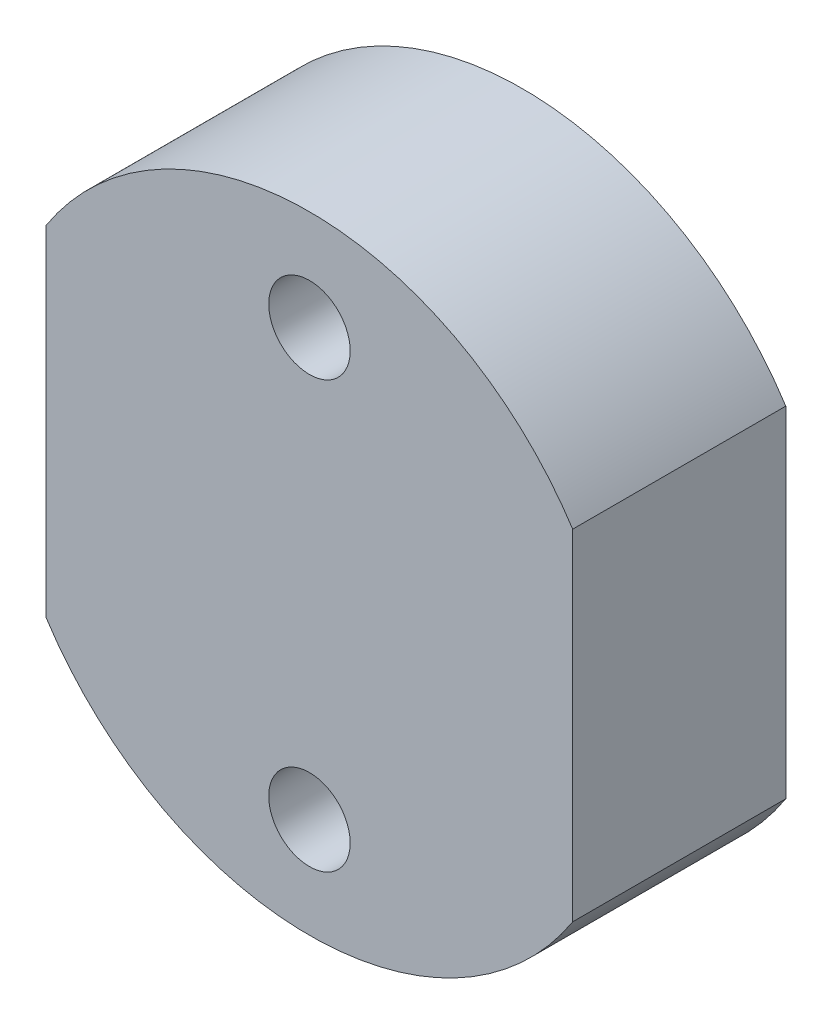
ISO-10303-21;
HEADER;
FILE_DESCRIPTION(('STEP AP214'),'2;1');
FILE_NAME('part.step','',(''),(''),'','','');
FILE_SCHEMA(('AUTOMOTIVE_DESIGN { 1 0 10303 214 1 1 1 1 }'));
ENDSEC;
DATA;
#1=APPLICATION_CONTEXT('core data for automotive mechanical design processes');
#2=APPLICATION_PROTOCOL_DEFINITION('international standard','automotive_design',2000,#1);
#3=PRODUCT_CONTEXT('',#1,'mechanical');
#4=PRODUCT('Part','Part','',(#3));
#5=PRODUCT_RELATED_PRODUCT_CATEGORY('part','',(#4));
#6=PRODUCT_DEFINITION_FORMATION('','',#4);
#7=PRODUCT_DEFINITION_CONTEXT('part definition',#1,'design');
#8=PRODUCT_DEFINITION('design','',#6,#7);
#9=PRODUCT_DEFINITION_SHAPE('','',#8);
#10=(LENGTH_UNIT() NAMED_UNIT(*) SI_UNIT(.MILLI.,.METRE.));
#11=(NAMED_UNIT(*) PLANE_ANGLE_UNIT() SI_UNIT($,.RADIAN.));
#12=(NAMED_UNIT(*) SI_UNIT($,.STERADIAN.) SOLID_ANGLE_UNIT());
#13=UNCERTAINTY_MEASURE_WITH_UNIT(LENGTH_MEASURE(1.E-05),#10,'distance_accuracy_value','');
#14=(GEOMETRIC_REPRESENTATION_CONTEXT(3) GLOBAL_UNCERTAINTY_ASSIGNED_CONTEXT((#13)) GLOBAL_UNIT_ASSIGNED_CONTEXT((#10,
#11,#12)) REPRESENTATION_CONTEXT('',''));
#15=CARTESIAN_POINT('',(0.,0.,0.));
#16=DIRECTION('',(0.,0.,1.));
#17=DIRECTION('',(1.,0.,0.));
#18=AXIS2_PLACEMENT_3D('',#15,#16,#17);
#19=CARTESIAN_POINT('',(0.,0.,0.));
#20=DIRECTION('',(0.,0.,1.));
#21=DIRECTION('',(1.,0.,0.));
#22=AXIS2_PLACEMENT_3D('',#19,#20,#21);
#23=PLANE('',#22);
#24=CARTESIAN_POINT('',(0.,0.,0.));
#25=DIRECTION('',(0.,0.,1.));
#26=DIRECTION('',(1.,0.,0.));
#27=AXIS2_PLACEMENT_3D('',#24,#25,#26);
#28=CIRCLE('',#27,2.5);
#29=CARTESIAN_POINT('',(2.10000000000001,-1.35646599662505,0.));
#30=VERTEX_POINT('',#29);
#31=CARTESIAN_POINT('',(-2.1,-1.35646599662506,0.));
#32=VERTEX_POINT('',#31);
#33=EDGE_CURVE('E64',#30,#32,#28,.F.);
#34=ORIENTED_EDGE('',*,*,#33,.F.);
#35=DIRECTION('',(0.,1.,0.));
#36=VECTOR('',#35,1.);
#37=CARTESIAN_POINT('',(2.09999999999999,1.35646599662505,0.));
#38=LINE('',#37,#36);
#39=CARTESIAN_POINT('',(2.09999999999999,1.35646599662506,0.));
#40=VERTEX_POINT('',#39);
#41=EDGE_CURVE('E59',#40,#30,#38,.F.);
#42=ORIENTED_EDGE('',*,*,#41,.F.);
#43=CARTESIAN_POINT('',(0.,0.,0.));
#44=DIRECTION('',(0.,0.,1.));
#45=DIRECTION('',(1.,0.,0.));
#46=AXIS2_PLACEMENT_3D('',#43,#44,#45);
#47=CIRCLE('',#46,2.5);
#48=CARTESIAN_POINT('',(-2.1,1.35646599662505,0.));
#49=VERTEX_POINT('',#48);
#50=EDGE_CURVE('E78',#49,#40,#47,.F.);
#51=ORIENTED_EDGE('',*,*,#50,.F.);
#52=DIRECTION('',(0.,-1.,0.));
#53=VECTOR('',#52,1.);
#54=CARTESIAN_POINT('',(-2.1,1.35646599662505,0.));
#55=LINE('',#54,#53);
#56=EDGE_CURVE('E74',#32,#49,#55,.F.);
#57=ORIENTED_EDGE('',*,*,#56,.F.);
#58=EDGE_LOOP('',(#34,#42,#51,#57));
#59=FACE_BOUND('',#58,.T.);
#60=CARTESIAN_POINT('',(0.,1.70000000000003,0.));
#61=DIRECTION('',(0.,0.,1.));
#62=DIRECTION('',(1.,0.,0.));
#63=AXIS2_PLACEMENT_3D('',#60,#61,#62);
#64=CIRCLE('',#63,0.325);
#65=CARTESIAN_POINT('',(0.325,1.70000000000003,0.));
#66=VERTEX_POINT('',#65);
#67=EDGE_CURVE('E82',#66,#66,#64,.F.);
#68=ORIENTED_EDGE('',*,*,#67,.T.);
#69=EDGE_LOOP('',(#68));
#70=FACE_BOUND('',#69,.T.);
#71=CARTESIAN_POINT('',(0.,-1.70000000000003,0.));
#72=DIRECTION('',(0.,0.,1.));
#73=DIRECTION('',(1.,0.,0.));
#74=AXIS2_PLACEMENT_3D('',#71,#72,#73);
#75=CIRCLE('',#74,0.325);
#76=CARTESIAN_POINT('',(0.325,-1.70000000000003,0.));
#77=VERTEX_POINT('',#76);
#78=EDGE_CURVE('E20',#77,#77,#75,.F.);
#79=ORIENTED_EDGE('',*,*,#78,.T.);
#80=EDGE_LOOP('',(#79));
#81=FACE_BOUND('',#80,.T.);
#82=ADVANCED_FACE('F17',(#59,#70,#81),#23,.T.);
#83=CARTESIAN_POINT('',(0.,-1.70000000000003,-1.7));
#84=DIRECTION('',(0.,0.,1.));
#85=DIRECTION('',(1.,0.,0.));
#86=AXIS2_PLACEMENT_3D('',#83,#84,#85);
#87=CYLINDRICAL_SURFACE('',#86,0.325);
#88=CARTESIAN_POINT('',(0.,-1.70000000000003,-1.7));
#89=DIRECTION('',(0.,0.,1.));
#90=DIRECTION('',(1.,0.,0.));
#91=AXIS2_PLACEMENT_3D('',#88,#89,#90);
#92=CIRCLE('',#91,0.325);
#93=CARTESIAN_POINT('',(0.325,-1.70000000000003,-1.7));
#94=VERTEX_POINT('',#93);
#95=EDGE_CURVE('E100',#94,#94,#92,.F.);
#96=ORIENTED_EDGE('',*,*,#95,.T.);
#97=EDGE_LOOP('',(#96));
#98=FACE_BOUND('',#97,.T.);
#99=ORIENTED_EDGE('',*,*,#78,.F.);
#100=EDGE_LOOP('',(#99));
#101=FACE_BOUND('',#100,.T.);
#102=ADVANCED_FACE('F113',(#98,#101),#87,.F.);
#103=CARTESIAN_POINT('',(0.,1.70000000000003,-1.7));
#104=DIRECTION('',(0.,0.,1.));
#105=DIRECTION('',(1.,0.,0.));
#106=AXIS2_PLACEMENT_3D('',#103,#104,#105);
#107=CYLINDRICAL_SURFACE('',#106,0.325);
#108=CARTESIAN_POINT('',(0.,1.70000000000003,-1.7));
#109=DIRECTION('',(0.,0.,1.));
#110=DIRECTION('',(1.,0.,0.));
#111=AXIS2_PLACEMENT_3D('',#108,#109,#110);
#112=CIRCLE('',#111,0.325);
#113=CARTESIAN_POINT('',(0.325,1.70000000000003,-1.7));
#114=VERTEX_POINT('',#113);
#115=EDGE_CURVE('E96',#114,#114,#112,.F.);
#116=ORIENTED_EDGE('',*,*,#115,.T.);
#117=EDGE_LOOP('',(#116));
#118=FACE_BOUND('',#117,.T.);
#119=ORIENTED_EDGE('',*,*,#67,.F.);
#120=EDGE_LOOP('',(#119));
#121=FACE_BOUND('',#120,.T.);
#122=ADVANCED_FACE('F115',(#118,#121),#107,.F.);
#123=CARTESIAN_POINT('',(-2.1,1.35646599662505,-1.7));
#124=DIRECTION('',(-1.,0.,0.));
#125=DIRECTION('',(0.,-1.,0.));
#126=AXIS2_PLACEMENT_3D('',#123,#124,#125);
#127=PLANE('',#126);
#128=DIRECTION('',(0.,1.,0.));
#129=VECTOR('',#128,1.);
#130=CARTESIAN_POINT('',(-2.1,0.,-1.7));
#131=LINE('',#130,#129);
#132=CARTESIAN_POINT('',(-2.1,1.35646599662505,-1.7));
#133=VERTEX_POINT('',#132);
#134=CARTESIAN_POINT('',(-2.1,-1.35646599662506,-1.7));
#135=VERTEX_POINT('',#134);
#136=EDGE_CURVE('E86',#133,#135,#131,.F.);
#137=ORIENTED_EDGE('',*,*,#136,.T.);
#138=DIRECTION('',(0.,0.,1.));
#139=VECTOR('',#138,1.);
#140=CARTESIAN_POINT('',(-2.1,-1.35646599662506,-1.7));
#141=LINE('',#140,#139);
#142=EDGE_CURVE('E69',#32,#135,#141,.F.);
#143=ORIENTED_EDGE('',*,*,#142,.F.);
#144=ORIENTED_EDGE('',*,*,#56,.T.);
#145=DIRECTION('',(0.,0.,1.));
#146=VECTOR('',#145,1.);
#147=CARTESIAN_POINT('',(-2.1,1.35646599662505,-1.7));
#148=LINE('',#147,#146);
#149=EDGE_CURVE('E103',#133,#49,#148,.T.);
#150=ORIENTED_EDGE('',*,*,#149,.F.);
#151=EDGE_LOOP('',(#137,#143,#144,#150));
#152=FACE_BOUND('',#151,.T.);
#153=ADVANCED_FACE('F85',(#152),#127,.T.);
#154=CARTESIAN_POINT('',(0.,0.,-1.7));
#155=DIRECTION('',(0.,0.,1.));
#156=DIRECTION('',(1.,0.,0.));
#157=AXIS2_PLACEMENT_3D('',#154,#155,#156);
#158=CYLINDRICAL_SURFACE('',#157,2.5);
#159=CARTESIAN_POINT('',(0.,0.,-1.7));
#160=DIRECTION('',(0.,0.,1.));
#161=DIRECTION('',(1.,0.,0.));
#162=AXIS2_PLACEMENT_3D('',#159,#160,#161);
#163=CIRCLE('',#162,2.5);
#164=CARTESIAN_POINT('',(2.10000000000001,-1.35646599662505,-1.7));
#165=VERTEX_POINT('',#164);
#166=EDGE_CURVE('E93',#135,#165,#163,.T.);
#167=ORIENTED_EDGE('',*,*,#166,.T.);
#168=DIRECTION('',(0.,0.,1.));
#169=VECTOR('',#168,1.);
#170=CARTESIAN_POINT('',(2.10000000000001,-1.35646599662505,-1.7));
#171=LINE('',#170,#169);
#172=EDGE_CURVE('E71',#30,#165,#171,.F.);
#173=ORIENTED_EDGE('',*,*,#172,.F.);
#174=ORIENTED_EDGE('',*,*,#33,.T.);
#175=ORIENTED_EDGE('',*,*,#142,.T.);
#176=EDGE_LOOP('',(#167,#173,#174,#175));
#177=FACE_BOUND('',#176,.T.);
#178=ADVANCED_FACE('F67',(#177),#158,.T.);
#179=CARTESIAN_POINT('',(2.09999999999999,1.35646599662505,-1.7));
#180=DIRECTION('',(1.,0.,0.));
#181=DIRECTION('',(0.,1.,0.));
#182=AXIS2_PLACEMENT_3D('',#179,#180,#181);
#183=PLANE('',#182);
#184=DIRECTION('',(0.,1.,0.));
#185=VECTOR('',#184,1.);
#186=CARTESIAN_POINT('',(2.10000000000001,0.,-1.7));
#187=LINE('',#186,#185);
#188=CARTESIAN_POINT('',(2.1,1.35646599662504,-1.7));
#189=VERTEX_POINT('',#188);
#190=EDGE_CURVE('E27',#165,#189,#187,.T.);
#191=ORIENTED_EDGE('',*,*,#190,.T.);
#192=DIRECTION('',(0.,0.,1.));
#193=VECTOR('',#192,1.);
#194=CARTESIAN_POINT('',(2.09999999999999,1.35646599662506,-1.7));
#195=LINE('',#194,#193);
#196=EDGE_CURVE('E38',#40,#189,#195,.F.);
#197=ORIENTED_EDGE('',*,*,#196,.F.);
#198=ORIENTED_EDGE('',*,*,#41,.T.);
#199=ORIENTED_EDGE('',*,*,#172,.T.);
#200=EDGE_LOOP('',(#191,#197,#198,#199));
#201=FACE_BOUND('',#200,.T.);
#202=ADVANCED_FACE('F132',(#201),#183,.T.);
#203=CARTESIAN_POINT('',(0.,0.,-1.7));
#204=DIRECTION('',(0.,0.,1.));
#205=DIRECTION('',(1.,0.,0.));
#206=AXIS2_PLACEMENT_3D('',#203,#204,#205);
#207=CYLINDRICAL_SURFACE('',#206,2.5);
#208=CARTESIAN_POINT('',(0.,0.,-1.7));
#209=DIRECTION('',(0.,0.,1.));
#210=DIRECTION('',(1.,0.,0.));
#211=AXIS2_PLACEMENT_3D('',#208,#209,#210);
#212=CIRCLE('',#211,2.5);
#213=EDGE_CURVE('E11',#189,#133,#212,.T.);
#214=ORIENTED_EDGE('',*,*,#213,.T.);
#215=ORIENTED_EDGE('',*,*,#149,.T.);
#216=ORIENTED_EDGE('',*,*,#50,.T.);
#217=ORIENTED_EDGE('',*,*,#196,.T.);
#218=EDGE_LOOP('',(#214,#215,#216,#217));
#219=FACE_BOUND('',#218,.T.);
#220=ADVANCED_FACE('F126',(#219),#207,.T.);
#221=CARTESIAN_POINT('',(0.,0.,-1.7));
#222=DIRECTION('',(0.,0.,1.));
#223=DIRECTION('',(1.,0.,0.));
#224=AXIS2_PLACEMENT_3D('',#221,#222,#223);
#225=PLANE('',#224);
#226=ORIENTED_EDGE('',*,*,#190,.F.);
#227=ORIENTED_EDGE('',*,*,#166,.F.);
#228=ORIENTED_EDGE('',*,*,#136,.F.);
#229=ORIENTED_EDGE('',*,*,#213,.F.);
#230=EDGE_LOOP('',(#226,#227,#228,#229));
#231=FACE_BOUND('',#230,.T.);
#232=ORIENTED_EDGE('',*,*,#115,.F.);
#233=EDGE_LOOP('',(#232));
#234=FACE_BOUND('',#233,.T.);
#235=ORIENTED_EDGE('',*,*,#95,.F.);
#236=EDGE_LOOP('',(#235));
#237=FACE_BOUND('',#236,.T.);
#238=ADVANCED_FACE('F124',(#231,#234,#237),#225,.F.);
#239=CLOSED_SHELL('',(#82,#102,#122,#153,#178,#202,#220,#238));
#240=MANIFOLD_SOLID_BREP('B1',#239);
#241=ADVANCED_BREP_SHAPE_REPRESENTATION('',(#18,#240),#14);
#242=SHAPE_DEFINITION_REPRESENTATION(#9,#241);
ENDSEC;
END-ISO-10303-21;
